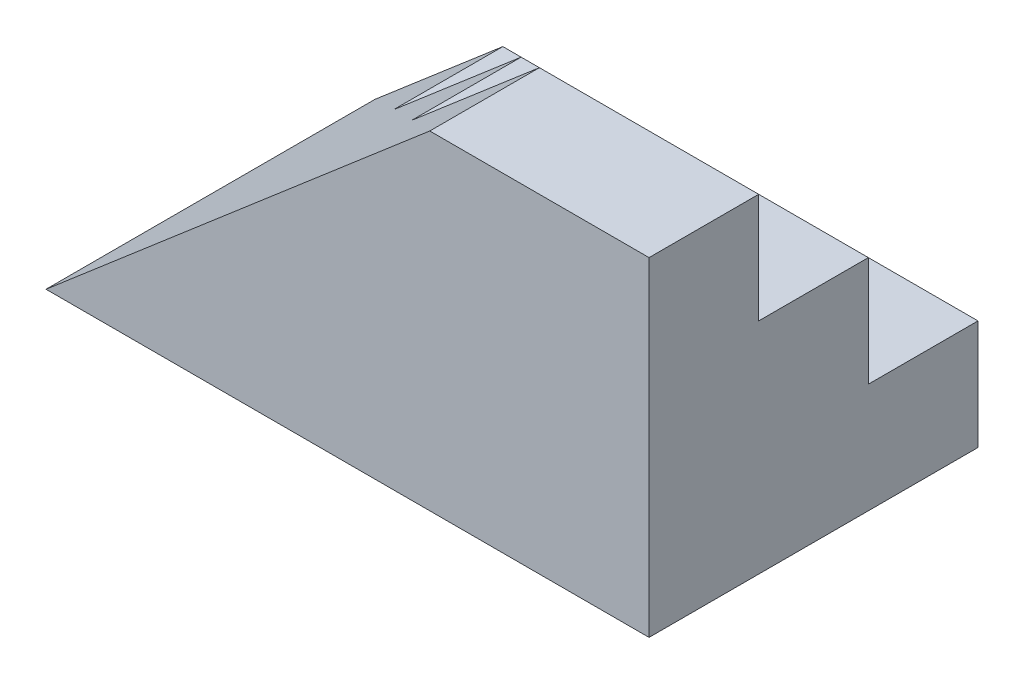
ISO-10303-21;
HEADER;
FILE_DESCRIPTION(('STEP AP214'),'2;1');
FILE_NAME('part.step','',(''),(''),'','','');
FILE_SCHEMA(('AUTOMOTIVE_DESIGN { 1 0 10303 214 1 1 1 1 }'));
ENDSEC;
DATA;
#1=APPLICATION_CONTEXT('core data for automotive mechanical design processes');
#2=APPLICATION_PROTOCOL_DEFINITION('international standard','automotive_design',2000,#1);
#3=PRODUCT_CONTEXT('',#1,'mechanical');
#4=PRODUCT('Part','Part','',(#3));
#5=PRODUCT_RELATED_PRODUCT_CATEGORY('part','',(#4));
#6=PRODUCT_DEFINITION_FORMATION('','',#4);
#7=PRODUCT_DEFINITION_CONTEXT('part definition',#1,'design');
#8=PRODUCT_DEFINITION('design','',#6,#7);
#9=PRODUCT_DEFINITION_SHAPE('','',#8);
#10=(LENGTH_UNIT() NAMED_UNIT(*) SI_UNIT(.MILLI.,.METRE.));
#11=(NAMED_UNIT(*) PLANE_ANGLE_UNIT() SI_UNIT($,.RADIAN.));
#12=(NAMED_UNIT(*) SI_UNIT($,.STERADIAN.) SOLID_ANGLE_UNIT());
#13=UNCERTAINTY_MEASURE_WITH_UNIT(LENGTH_MEASURE(1.E-05),#10,'distance_accuracy_value','');
#14=(GEOMETRIC_REPRESENTATION_CONTEXT(3) GLOBAL_UNCERTAINTY_ASSIGNED_CONTEXT((#13)) GLOBAL_UNIT_ASSIGNED_CONTEXT((#10,
#11,#12)) REPRESENTATION_CONTEXT('',''));
#15=CARTESIAN_POINT('',(0.,0.,0.));
#16=DIRECTION('',(0.,0.,1.));
#17=DIRECTION('',(1.,0.,0.));
#18=AXIS2_PLACEMENT_3D('',#15,#16,#17);
#19=CARTESIAN_POINT('',(110.,60.,-20.));
#20=DIRECTION('',(0.,-1.,0.));
#21=DIRECTION('',(0.,0.,-1.));
#22=AXIS2_PLACEMENT_3D('',#19,#20,#21);
#23=PLANE('',#22);
#24=DIRECTION('',(0.,0.,-1.));
#25=VECTOR('',#24,1.);
#26=CARTESIAN_POINT('',(70.,60.,173.655549868123));
#27=LINE('',#26,#25);
#28=CARTESIAN_POINT('',(70.,60.,0.));
#29=VERTEX_POINT('',#28);
#30=CARTESIAN_POINT('',(70.,60.,-20.));
#31=VERTEX_POINT('',#30);
#32=EDGE_CURVE('E54',#29,#31,#27,.T.);
#33=ORIENTED_EDGE('',*,*,#32,.F.);
#34=DIRECTION('',(-1.,0.,0.));
#35=VECTOR('',#34,1.);
#36=CARTESIAN_POINT('',(110.,60.,0.));
#37=LINE('',#36,#35);
#38=CARTESIAN_POINT('',(110.,60.,0.));
#39=VERTEX_POINT('',#38);
#40=EDGE_CURVE('E156',#39,#29,#37,.T.);
#41=ORIENTED_EDGE('',*,*,#40,.F.);
#42=DIRECTION('',(0.,0.,1.));
#43=VECTOR('',#42,1.);
#44=CARTESIAN_POINT('',(110.,60.,-20.));
#45=LINE('',#44,#43);
#46=CARTESIAN_POINT('',(110.,60.,-20.));
#47=VERTEX_POINT('',#46);
#48=EDGE_CURVE('E154',#47,#39,#45,.T.);
#49=ORIENTED_EDGE('',*,*,#48,.F.);
#50=DIRECTION('',(-1.,0.,0.));
#51=VECTOR('',#50,1.);
#52=CARTESIAN_POINT('',(110.,60.,-20.));
#53=LINE('',#52,#51);
#54=EDGE_CURVE('E116',#47,#31,#53,.T.);
#55=ORIENTED_EDGE('',*,*,#54,.T.);
#56=EDGE_LOOP('',(#33,#41,#49,#55));
#57=FACE_BOUND('',#56,.T.);
#58=ADVANCED_FACE('F39',(#57),#23,.F.);
#59=CARTESIAN_POINT('',(110.,60.,0.));
#60=DIRECTION('',(0.,0.,-1.));
#61=DIRECTION('',(-1.,0.,0.));
#62=AXIS2_PLACEMENT_3D('',#59,#60,#61);
#63=PLANE('',#62);
#64=DIRECTION('',(0.759256602365297,0.650791373455968,0.));
#65=VECTOR('',#64,1.);
#66=CARTESIAN_POINT('',(93.0588235294118,79.7647058823529,0.));
#67=LINE('',#66,#65);
#68=CARTESIAN_POINT('',(0.,0.,0.));
#69=VERTEX_POINT('',#68);
#70=EDGE_CURVE('E130',#69,#29,#67,.T.);
#71=ORIENTED_EDGE('',*,*,#70,.F.);
#72=DIRECTION('',(-1.,0.,0.));
#73=VECTOR('',#72,1.);
#74=CARTESIAN_POINT('',(110.,0.,0.));
#75=LINE('',#74,#73);
#76=CARTESIAN_POINT('',(110.,0.,0.));
#77=VERTEX_POINT('',#76);
#78=EDGE_CURVE('E47',#77,#69,#75,.T.);
#79=ORIENTED_EDGE('',*,*,#78,.F.);
#80=DIRECTION('',(0.,-1.,0.));
#81=VECTOR('',#80,1.);
#82=CARTESIAN_POINT('',(110.,60.,0.));
#83=LINE('',#82,#81);
#84=EDGE_CURVE('E140',#39,#77,#83,.T.);
#85=ORIENTED_EDGE('',*,*,#84,.F.);
#86=ORIENTED_EDGE('',*,*,#40,.T.);
#87=EDGE_LOOP('',(#71,#79,#85,#86));
#88=FACE_BOUND('',#87,.T.);
#89=ADVANCED_FACE('F41',(#88),#63,.F.);
#90=CARTESIAN_POINT('',(110.,0.,-60.));
#91=DIRECTION('',(0.,0.,1.));
#92=DIRECTION('',(1.,0.,0.));
#93=AXIS2_PLACEMENT_3D('',#90,#91,#92);
#94=PLANE('',#93);
#95=DIRECTION('',(-0.759256602365297,-0.650791373455968,0.));
#96=VECTOR('',#95,1.);
#97=CARTESIAN_POINT('',(63.4117647058824,54.3529411764706,-60.));
#98=LINE('',#97,#96);
#99=CARTESIAN_POINT('',(23.3333333333333,20.,-60.));
#100=VERTEX_POINT('',#99);
#101=CARTESIAN_POINT('',(0.,0.,-60.));
#102=VERTEX_POINT('',#101);
#103=EDGE_CURVE('E62',#100,#102,#98,.T.);
#104=ORIENTED_EDGE('',*,*,#103,.F.);
#105=DIRECTION('',(-1.,0.,0.));
#106=VECTOR('',#105,1.);
#107=CARTESIAN_POINT('',(110.,20.,-60.));
#108=LINE('',#107,#106);
#109=CARTESIAN_POINT('',(110.,20.,-60.));
#110=VERTEX_POINT('',#109);
#111=EDGE_CURVE('E164',#110,#100,#108,.T.);
#112=ORIENTED_EDGE('',*,*,#111,.F.);
#113=DIRECTION('',(0.,1.,0.));
#114=VECTOR('',#113,1.);
#115=CARTESIAN_POINT('',(110.,0.,-60.));
#116=LINE('',#115,#114);
#117=CARTESIAN_POINT('',(110.,0.,-60.));
#118=VERTEX_POINT('',#117);
#119=EDGE_CURVE('E145',#118,#110,#116,.T.);
#120=ORIENTED_EDGE('',*,*,#119,.F.);
#121=DIRECTION('',(-1.,0.,0.));
#122=VECTOR('',#121,1.);
#123=CARTESIAN_POINT('',(110.,0.,-60.));
#124=LINE('',#123,#122);
#125=EDGE_CURVE('E166',#118,#102,#124,.T.);
#126=ORIENTED_EDGE('',*,*,#125,.T.);
#127=EDGE_LOOP('',(#104,#112,#120,#126));
#128=FACE_BOUND('',#127,.T.);
#129=ADVANCED_FACE('F184',(#128),#94,.F.);
#130=CARTESIAN_POINT('',(110.,20.,-60.));
#131=DIRECTION('',(0.,-1.,0.));
#132=DIRECTION('',(0.,0.,-1.));
#133=AXIS2_PLACEMENT_3D('',#130,#131,#132);
#134=PLANE('',#133);
#135=DIRECTION('',(0.,0.,-1.));
#136=VECTOR('',#135,1.);
#137=CARTESIAN_POINT('',(23.3333333333333,20.,-60.));
#138=LINE('',#137,#136);
#139=CARTESIAN_POINT('',(23.3333333333334,20.,-40.));
#140=VERTEX_POINT('',#139);
#141=EDGE_CURVE('E134',#140,#100,#138,.T.);
#142=ORIENTED_EDGE('',*,*,#141,.F.);
#143=DIRECTION('',(-1.,0.,0.));
#144=VECTOR('',#143,1.);
#145=CARTESIAN_POINT('',(110.,20.,-40.));
#146=LINE('',#145,#144);
#147=CARTESIAN_POINT('',(110.,20.,-40.));
#148=VERTEX_POINT('',#147);
#149=EDGE_CURVE('E161',#148,#140,#146,.T.);
#150=ORIENTED_EDGE('',*,*,#149,.F.);
#151=DIRECTION('',(0.,0.,1.));
#152=VECTOR('',#151,1.);
#153=CARTESIAN_POINT('',(110.,20.,-60.));
#154=LINE('',#153,#152);
#155=EDGE_CURVE('E147',#110,#148,#154,.T.);
#156=ORIENTED_EDGE('',*,*,#155,.F.);
#157=ORIENTED_EDGE('',*,*,#111,.T.);
#158=EDGE_LOOP('',(#142,#150,#156,#157));
#159=FACE_BOUND('',#158,.T.);
#160=ADVANCED_FACE('F176',(#159),#134,.F.);
#161=CARTESIAN_POINT('',(110.,20.,-40.));
#162=DIRECTION('',(0.,0.,1.));
#163=DIRECTION('',(1.,0.,0.));
#164=AXIS2_PLACEMENT_3D('',#161,#162,#163);
#165=PLANE('',#164);
#166=DIRECTION('',(-0.759256602365297,-0.650791373455968,0.));
#167=VECTOR('',#166,1.);
#168=CARTESIAN_POINT('',(73.2941176470588,62.8235294117647,-40.));
#169=LINE('',#168,#167);
#170=CARTESIAN_POINT('',(46.6666666666667,40.,-40.));
#171=VERTEX_POINT('',#170);
#172=EDGE_CURVE('E125',#171,#140,#169,.T.);
#173=ORIENTED_EDGE('',*,*,#172,.F.);
#174=DIRECTION('',(-1.,0.,0.));
#175=VECTOR('',#174,1.);
#176=CARTESIAN_POINT('',(110.,40.,-40.));
#177=LINE('',#176,#175);
#178=CARTESIAN_POINT('',(110.,40.,-40.));
#179=VERTEX_POINT('',#178);
#180=EDGE_CURVE('E115',#179,#171,#177,.T.);
#181=ORIENTED_EDGE('',*,*,#180,.F.);
#182=DIRECTION('',(0.,1.,0.));
#183=VECTOR('',#182,1.);
#184=CARTESIAN_POINT('',(110.,20.,-40.));
#185=LINE('',#184,#183);
#186=EDGE_CURVE('E149',#148,#179,#185,.T.);
#187=ORIENTED_EDGE('',*,*,#186,.F.);
#188=ORIENTED_EDGE('',*,*,#149,.T.);
#189=EDGE_LOOP('',(#173,#181,#187,#188));
#190=FACE_BOUND('',#189,.T.);
#191=ADVANCED_FACE('F180',(#190),#165,.F.);
#192=CARTESIAN_POINT('',(110.,40.,-40.));
#193=DIRECTION('',(0.,-1.,0.));
#194=DIRECTION('',(0.,0.,-1.));
#195=AXIS2_PLACEMENT_3D('',#192,#193,#194);
#196=PLANE('',#195);
#197=DIRECTION('',(0.,0.,-1.));
#198=VECTOR('',#197,1.);
#199=CARTESIAN_POINT('',(46.6666666666667,40.,-40.));
#200=LINE('',#199,#198);
#201=CARTESIAN_POINT('',(46.6666666666667,40.,-20.));
#202=VERTEX_POINT('',#201);
#203=EDGE_CURVE('E120',#202,#171,#200,.T.);
#204=ORIENTED_EDGE('',*,*,#203,.F.);
#205=DIRECTION('',(-1.,0.,0.));
#206=VECTOR('',#205,1.);
#207=CARTESIAN_POINT('',(110.,40.,-20.));
#208=LINE('',#207,#206);
#209=CARTESIAN_POINT('',(110.,40.,-20.));
#210=VERTEX_POINT('',#209);
#211=EDGE_CURVE('E108',#210,#202,#208,.T.);
#212=ORIENTED_EDGE('',*,*,#211,.F.);
#213=DIRECTION('',(0.,0.,1.));
#214=VECTOR('',#213,1.);
#215=CARTESIAN_POINT('',(110.,40.,-40.));
#216=LINE('',#215,#214);
#217=EDGE_CURVE('E151',#179,#210,#216,.T.);
#218=ORIENTED_EDGE('',*,*,#217,.F.);
#219=ORIENTED_EDGE('',*,*,#180,.T.);
#220=EDGE_LOOP('',(#204,#212,#218,#219));
#221=FACE_BOUND('',#220,.T.);
#222=ADVANCED_FACE('F121',(#221),#196,.F.);
#223=CARTESIAN_POINT('',(110.,40.,-20.));
#224=DIRECTION('',(0.,0.,1.));
#225=DIRECTION('',(1.,0.,0.));
#226=AXIS2_PLACEMENT_3D('',#223,#224,#225);
#227=PLANE('',#226);
#228=DIRECTION('',(-0.759256602365297,-0.650791373455968,0.));
#229=VECTOR('',#228,1.);
#230=CARTESIAN_POINT('',(83.1764705882353,71.2941176470588,-20.));
#231=LINE('',#230,#229);
#232=EDGE_CURVE('E11',#31,#202,#231,.T.);
#233=ORIENTED_EDGE('',*,*,#232,.F.);
#234=ORIENTED_EDGE('',*,*,#54,.F.);
#235=DIRECTION('',(0.,1.,0.));
#236=VECTOR('',#235,1.);
#237=CARTESIAN_POINT('',(110.,40.,-20.));
#238=LINE('',#237,#236);
#239=EDGE_CURVE('E112',#210,#47,#238,.T.);
#240=ORIENTED_EDGE('',*,*,#239,.F.);
#241=ORIENTED_EDGE('',*,*,#211,.T.);
#242=EDGE_LOOP('',(#233,#234,#240,#241));
#243=FACE_BOUND('',#242,.T.);
#244=ADVANCED_FACE('F110',(#243),#227,.F.);
#245=CARTESIAN_POINT('',(110.,0.,0.));
#246=DIRECTION('',(0.,1.,0.));
#247=DIRECTION('',(0.,0.,1.));
#248=AXIS2_PLACEMENT_3D('',#245,#246,#247);
#249=PLANE('',#248);
#250=DIRECTION('',(0.,0.,-1.));
#251=VECTOR('',#250,1.);
#252=CARTESIAN_POINT('',(0.,0.,0.));
#253=LINE('',#252,#251);
#254=EDGE_CURVE('E139',#69,#102,#253,.T.);
#255=ORIENTED_EDGE('',*,*,#254,.T.);
#256=ORIENTED_EDGE('',*,*,#125,.F.);
#257=DIRECTION('',(0.,0.,-1.));
#258=VECTOR('',#257,1.);
#259=CARTESIAN_POINT('',(110.,0.,0.));
#260=LINE('',#259,#258);
#261=EDGE_CURVE('E143',#77,#118,#260,.T.);
#262=ORIENTED_EDGE('',*,*,#261,.F.);
#263=ORIENTED_EDGE('',*,*,#78,.T.);
#264=EDGE_LOOP('',(#255,#256,#262,#263));
#265=FACE_BOUND('',#264,.T.);
#266=ADVANCED_FACE('F170',(#265),#249,.F.);
#267=CARTESIAN_POINT('',(110.,0.,0.));
#268=DIRECTION('',(1.,0.,0.));
#269=DIRECTION('',(0.,0.,-1.));
#270=AXIS2_PLACEMENT_3D('',#267,#268,#269);
#271=PLANE('',#270);
#272=ORIENTED_EDGE('',*,*,#84,.T.);
#273=ORIENTED_EDGE('',*,*,#261,.T.);
#274=ORIENTED_EDGE('',*,*,#119,.T.);
#275=ORIENTED_EDGE('',*,*,#155,.T.);
#276=ORIENTED_EDGE('',*,*,#186,.T.);
#277=ORIENTED_EDGE('',*,*,#217,.T.);
#278=ORIENTED_EDGE('',*,*,#239,.T.);
#279=ORIENTED_EDGE('',*,*,#48,.T.);
#280=EDGE_LOOP('',(#272,#273,#274,#275,#276,#277,#278,#279));
#281=FACE_BOUND('',#280,.T.);
#282=ADVANCED_FACE('F182',(#281),#271,.T.);
#283=CARTESIAN_POINT('',(0.,0.,173.655549868123));
#284=DIRECTION('',(-0.650791373455968,0.759256602365297,0.));
#285=DIRECTION('',(-0.759256602365297,-0.650791373455968,0.));
#286=AXIS2_PLACEMENT_3D('',#283,#284,#285);
#287=PLANE('',#286);
#288=ORIENTED_EDGE('',*,*,#254,.F.);
#289=ORIENTED_EDGE('',*,*,#70,.T.);
#290=ORIENTED_EDGE('',*,*,#32,.T.);
#291=ORIENTED_EDGE('',*,*,#232,.T.);
#292=ORIENTED_EDGE('',*,*,#203,.T.);
#293=ORIENTED_EDGE('',*,*,#172,.T.);
#294=ORIENTED_EDGE('',*,*,#141,.T.);
#295=ORIENTED_EDGE('',*,*,#103,.T.);
#296=EDGE_LOOP('',(#288,#289,#290,#291,#292,#293,#294,#295));
#297=FACE_BOUND('',#296,.T.);
#298=ADVANCED_FACE('F128',(#297),#287,.T.);
#299=CLOSED_SHELL('',(#58,#89,#129,#160,#191,#222,#244,#266,#282,#298));
#300=MANIFOLD_SOLID_BREP('B2',#299);
#301=ADVANCED_BREP_SHAPE_REPRESENTATION('',(#18,#300),#14);
#302=SHAPE_DEFINITION_REPRESENTATION(#9,#301);
ENDSEC;
END-ISO-10303-21;
